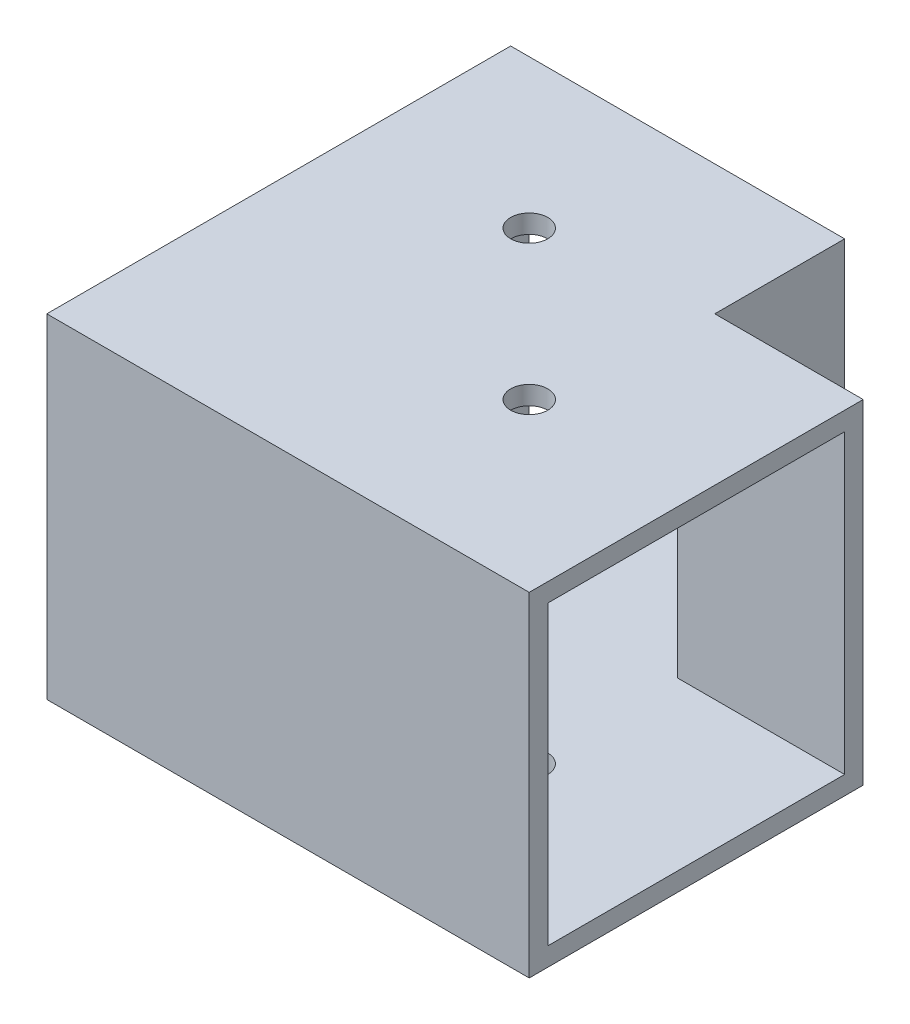
ISO-10303-21;
HEADER;
FILE_DESCRIPTION(('STEP AP214'),'2;1');
FILE_NAME('part.step','',(''),(''),'','','');
FILE_SCHEMA(('AUTOMOTIVE_DESIGN { 1 0 10303 214 1 1 1 1 }'));
ENDSEC;
DATA;
#1=APPLICATION_CONTEXT('core data for automotive mechanical design processes');
#2=APPLICATION_PROTOCOL_DEFINITION('international standard','automotive_design',2000,#1);
#3=PRODUCT_CONTEXT('',#1,'mechanical');
#4=PRODUCT('Part','Part','',(#3));
#5=PRODUCT_RELATED_PRODUCT_CATEGORY('part','',(#4));
#6=PRODUCT_DEFINITION_FORMATION('','',#4);
#7=PRODUCT_DEFINITION_CONTEXT('part definition',#1,'design');
#8=PRODUCT_DEFINITION('design','',#6,#7);
#9=PRODUCT_DEFINITION_SHAPE('','',#8);
#10=(LENGTH_UNIT() NAMED_UNIT(*) SI_UNIT(.MILLI.,.METRE.));
#11=(NAMED_UNIT(*) PLANE_ANGLE_UNIT() SI_UNIT($,.RADIAN.));
#12=(NAMED_UNIT(*) SI_UNIT($,.STERADIAN.) SOLID_ANGLE_UNIT());
#13=UNCERTAINTY_MEASURE_WITH_UNIT(LENGTH_MEASURE(1.E-05),#10,'distance_accuracy_value','');
#14=(GEOMETRIC_REPRESENTATION_CONTEXT(3) GLOBAL_UNCERTAINTY_ASSIGNED_CONTEXT((#13)) GLOBAL_UNIT_ASSIGNED_CONTEXT((#10,
#11,#12)) REPRESENTATION_CONTEXT('',''));
#15=CARTESIAN_POINT('',(0.,0.,0.));
#16=DIRECTION('',(0.,0.,1.));
#17=DIRECTION('',(1.,0.,0.));
#18=AXIS2_PLACEMENT_3D('',#15,#16,#17);
#19=CARTESIAN_POINT('',(0.,0.,50.8));
#20=DIRECTION('',(0.,0.,1.));
#21=DIRECTION('',(1.,0.,0.));
#22=AXIS2_PLACEMENT_3D('',#19,#20,#21);
#23=PLANE('',#22);
#24=DIRECTION('',(-1.,0.,0.));
#25=VECTOR('',#24,1.);
#26=CARTESIAN_POINT('',(107.95,50.8,50.8));
#27=LINE('',#26,#25);
#28=CARTESIAN_POINT('',(107.95,50.8,50.8));
#29=VERTEX_POINT('',#28);
#30=CARTESIAN_POINT('',(50.8,50.8,50.8));
#31=VERTEX_POINT('',#30);
#32=EDGE_CURVE('E200',#29,#31,#27,.T.);
#33=ORIENTED_EDGE('',*,*,#32,.T.);
#34=DIRECTION('',(0.,1.,0.));
#35=VECTOR('',#34,1.);
#36=CARTESIAN_POINT('',(50.8,-50.8,50.8));
#37=LINE('',#36,#35);
#38=CARTESIAN_POINT('',(50.8,-50.8,50.8));
#39=VERTEX_POINT('',#38);
#40=EDGE_CURVE('E254',#39,#31,#37,.T.);
#41=ORIENTED_EDGE('',*,*,#40,.F.);
#42=DIRECTION('',(-1.,0.,0.));
#43=VECTOR('',#42,1.);
#44=CARTESIAN_POINT('',(107.95,-50.8,50.8));
#45=LINE('',#44,#43);
#46=CARTESIAN_POINT('',(107.95,-50.8,50.8));
#47=VERTEX_POINT('',#46);
#48=EDGE_CURVE('E225',#47,#39,#45,.T.);
#49=ORIENTED_EDGE('',*,*,#48,.F.);
#50=DIRECTION('',(0.,1.,0.));
#51=VECTOR('',#50,1.);
#52=CARTESIAN_POINT('',(107.95,-50.8,50.8));
#53=LINE('',#52,#51);
#54=EDGE_CURVE('E217',#47,#29,#53,.T.);
#55=ORIENTED_EDGE('',*,*,#54,.T.);
#56=EDGE_LOOP('',(#33,#41,#49,#55));
#57=FACE_BOUND('',#56,.T.);
#58=ADVANCED_FACE('F88',(#57),#23,.T.);
#59=DIRECTION('',(0.,-1.,0.));
#60=VECTOR('',#59,1.);
#61=CARTESIAN_POINT('',(-50.8,-50.8,50.8));
#62=LINE('',#61,#60);
#63=CARTESIAN_POINT('',(-50.8,50.8,50.8));
#64=VERTEX_POINT('',#63);
#65=CARTESIAN_POINT('',(-50.8,-50.8,50.8));
#66=VERTEX_POINT('',#65);
#67=EDGE_CURVE('E257',#64,#66,#62,.T.);
#68=ORIENTED_EDGE('',*,*,#67,.F.);
#69=DIRECTION('',(1.,0.,0.));
#70=VECTOR('',#69,1.);
#71=CARTESIAN_POINT('',(-214.368613719877,50.8,50.8));
#72=LINE('',#71,#70);
#73=CARTESIAN_POINT('',(-57.15,50.8,50.8));
#74=VERTEX_POINT('',#73);
#75=EDGE_CURVE('E110',#74,#64,#72,.T.);
#76=ORIENTED_EDGE('',*,*,#75,.F.);
#77=DIRECTION('',(0.,-1.,0.));
#78=VECTOR('',#77,1.);
#79=CARTESIAN_POINT('',(-57.15,0.,50.8));
#80=LINE('',#79,#78);
#81=CARTESIAN_POINT('',(-57.15,-50.8,50.8));
#82=VERTEX_POINT('',#81);
#83=EDGE_CURVE('E105',#74,#82,#80,.T.);
#84=ORIENTED_EDGE('',*,*,#83,.T.);
#85=DIRECTION('',(1.,0.,0.));
#86=VECTOR('',#85,1.);
#87=CARTESIAN_POINT('',(-214.368613719877,-50.8,50.8));
#88=LINE('',#87,#86);
#89=EDGE_CURVE('E212',#82,#66,#88,.T.);
#90=ORIENTED_EDGE('',*,*,#89,.T.);
#91=EDGE_LOOP('',(#68,#76,#84,#90));
#92=FACE_BOUND('',#91,.T.);
#93=ADVANCED_FACE('F355',(#92),#23,.T.);
#94=CARTESIAN_POINT('',(57.15,0.,50.8));
#95=DIRECTION('',(-1.,0.,0.));
#96=DIRECTION('',(0.,0.,1.));
#97=AXIS2_PLACEMENT_3D('',#94,#95,#96);
#98=PLANE('',#97);
#99=DIRECTION('',(0.,1.,0.));
#100=VECTOR('',#99,1.);
#101=CARTESIAN_POINT('',(57.15,-50.8,44.45));
#102=LINE('',#101,#100);
#103=CARTESIAN_POINT('',(57.15,-57.15,44.45));
#104=VERTEX_POINT('',#103);
#105=CARTESIAN_POINT('',(57.15,57.15,44.45));
#106=VERTEX_POINT('',#105);
#107=EDGE_CURVE('E229',#104,#106,#102,.T.);
#108=ORIENTED_EDGE('',*,*,#107,.F.);
#109=DIRECTION('',(0.,0.,-1.));
#110=VECTOR('',#109,1.);
#111=CARTESIAN_POINT('',(57.15,-57.15,50.8));
#112=LINE('',#111,#110);
#113=CARTESIAN_POINT('',(57.15,-57.15,0.));
#114=VERTEX_POINT('',#113);
#115=EDGE_CURVE('E283',#104,#114,#112,.T.);
#116=ORIENTED_EDGE('',*,*,#115,.T.);
#117=DIRECTION('',(0.,1.,0.));
#118=VECTOR('',#117,1.);
#119=CARTESIAN_POINT('',(57.15,0.,0.));
#120=LINE('',#119,#118);
#121=CARTESIAN_POINT('',(57.15,57.15,0.));
#122=VERTEX_POINT('',#121);
#123=EDGE_CURVE('E281',#114,#122,#120,.T.);
#124=ORIENTED_EDGE('',*,*,#123,.T.);
#125=DIRECTION('',(0.,0.,-1.));
#126=VECTOR('',#125,1.);
#127=CARTESIAN_POINT('',(57.15,57.15,50.8));
#128=LINE('',#127,#126);
#129=EDGE_CURVE('E12',#106,#122,#128,.T.);
#130=ORIENTED_EDGE('',*,*,#129,.F.);
#131=EDGE_LOOP('',(#108,#116,#124,#130));
#132=FACE_BOUND('',#131,.T.);
#133=ADVANCED_FACE('F90',(#132),#98,.F.);
#134=CARTESIAN_POINT('',(0.,0.,0.));
#135=DIRECTION('',(0.,0.,1.));
#136=DIRECTION('',(1.,0.,0.));
#137=AXIS2_PLACEMENT_3D('',#134,#135,#136);
#138=PLANE('',#137);
#139=ORIENTED_EDGE('',*,*,#123,.F.);
#140=DIRECTION('',(1.,0.,0.));
#141=VECTOR('',#140,1.);
#142=CARTESIAN_POINT('',(0.,-57.15,0.));
#143=LINE('',#142,#141);
#144=CARTESIAN_POINT('',(-57.15,-57.15,0.));
#145=VERTEX_POINT('',#144);
#146=EDGE_CURVE('E284',#145,#114,#143,.T.);
#147=ORIENTED_EDGE('',*,*,#146,.F.);
#148=DIRECTION('',(0.,-1.,0.));
#149=VECTOR('',#148,1.);
#150=CARTESIAN_POINT('',(-57.15,0.,0.));
#151=LINE('',#150,#149);
#152=CARTESIAN_POINT('',(-57.15,57.15,0.));
#153=VERTEX_POINT('',#152);
#154=EDGE_CURVE('E289',#153,#145,#151,.T.);
#155=ORIENTED_EDGE('',*,*,#154,.F.);
#156=DIRECTION('',(-1.,0.,0.));
#157=VECTOR('',#156,1.);
#158=CARTESIAN_POINT('',(0.,57.15,0.));
#159=LINE('',#158,#157);
#160=EDGE_CURVE('E287',#122,#153,#159,.T.);
#161=ORIENTED_EDGE('',*,*,#160,.F.);
#162=EDGE_LOOP('',(#139,#147,#155,#161));
#163=FACE_BOUND('',#162,.T.);
#164=DIRECTION('',(0.,1.,0.));
#165=VECTOR('',#164,1.);
#166=CARTESIAN_POINT('',(50.8,-50.8,0.));
#167=LINE('',#166,#165);
#168=CARTESIAN_POINT('',(50.8,-50.8,0.));
#169=VERTEX_POINT('',#168);
#170=CARTESIAN_POINT('',(50.8,50.8,0.));
#171=VERTEX_POINT('',#170);
#172=EDGE_CURVE('E253',#169,#171,#167,.T.);
#173=ORIENTED_EDGE('',*,*,#172,.T.);
#174=DIRECTION('',(-1.,0.,0.));
#175=VECTOR('',#174,1.);
#176=CARTESIAN_POINT('',(-50.8,50.8,0.));
#177=LINE('',#176,#175);
#178=CARTESIAN_POINT('',(-50.8,50.8,0.));
#179=VERTEX_POINT('',#178);
#180=EDGE_CURVE('E264',#171,#179,#177,.T.);
#181=ORIENTED_EDGE('',*,*,#180,.T.);
#182=DIRECTION('',(0.,-1.,0.));
#183=VECTOR('',#182,1.);
#184=CARTESIAN_POINT('',(-50.8,-50.8,0.));
#185=LINE('',#184,#183);
#186=CARTESIAN_POINT('',(-50.8,-50.8,0.));
#187=VERTEX_POINT('',#186);
#188=EDGE_CURVE('E267',#179,#187,#185,.T.);
#189=ORIENTED_EDGE('',*,*,#188,.T.);
#190=DIRECTION('',(1.,0.,0.));
#191=VECTOR('',#190,1.);
#192=CARTESIAN_POINT('',(-50.8,-50.8,0.));
#193=LINE('',#192,#191);
#194=EDGE_CURVE('E258',#187,#169,#193,.T.);
#195=ORIENTED_EDGE('',*,*,#194,.T.);
#196=EDGE_LOOP('',(#173,#181,#189,#195));
#197=FACE_BOUND('',#196,.T.);
#198=ADVANCED_FACE('F326',(#163,#197),#138,.F.);
#199=CARTESIAN_POINT('',(0.,57.15,50.8));
#200=DIRECTION('',(0.,-1.,0.));
#201=DIRECTION('',(0.,0.,-1.));
#202=AXIS2_PLACEMENT_3D('',#199,#200,#201);
#203=PLANE('',#202);
#204=CARTESIAN_POINT('',(50.8,57.15,101.6));
#205=DIRECTION('',(0.,-1.,0.));
#206=DIRECTION('',(-1.,0.,0.));
#207=AXIS2_PLACEMENT_3D('',#204,#205,#206);
#208=CIRCLE('',#207,6.35);
#209=CARTESIAN_POINT('',(50.8,57.15,107.95));
#210=VERTEX_POINT('',#209);
#211=EDGE_CURVE('E379',#210,#210,#208,.T.);
#212=ORIENTED_EDGE('',*,*,#211,.T.);
#213=EDGE_LOOP('',(#212));
#214=FACE_BOUND('',#213,.T.);
#215=CARTESIAN_POINT('',(0.,57.15,50.8));
#216=DIRECTION('',(0.,1.,0.));
#217=DIRECTION('',(0.,0.,1.));
#218=AXIS2_PLACEMENT_3D('',#215,#216,#217);
#219=CIRCLE('',#218,6.35);
#220=CARTESIAN_POINT('',(0.,57.15,57.15));
#221=VERTEX_POINT('',#220);
#222=EDGE_CURVE('E307',#221,#221,#219,.T.);
#223=ORIENTED_EDGE('',*,*,#222,.F.);
#224=EDGE_LOOP('',(#223));
#225=FACE_BOUND('',#224,.T.);
#226=DIRECTION('',(0.,0.,-1.));
#227=VECTOR('',#226,1.);
#228=CARTESIAN_POINT('',(-57.15,57.15,50.8));
#229=LINE('',#228,#227);
#230=CARTESIAN_POINT('',(-57.15,57.15,158.75));
#231=VERTEX_POINT('',#230);
#232=EDGE_CURVE('E97',#231,#153,#229,.T.);
#233=ORIENTED_EDGE('',*,*,#232,.F.);
#234=DIRECTION('',(-1.,0.,0.));
#235=VECTOR('',#234,1.);
#236=CARTESIAN_POINT('',(107.95,57.15,158.75));
#237=LINE('',#236,#235);
#238=CARTESIAN_POINT('',(107.95,57.15,158.75));
#239=VERTEX_POINT('',#238);
#240=EDGE_CURVE('E247',#239,#231,#237,.T.);
#241=ORIENTED_EDGE('',*,*,#240,.F.);
#242=DIRECTION('',(0.,0.,1.));
#243=VECTOR('',#242,1.);
#244=CARTESIAN_POINT('',(107.95,57.15,50.8));
#245=LINE('',#244,#243);
#246=CARTESIAN_POINT('',(107.95,57.15,44.45));
#247=VERTEX_POINT('',#246);
#248=EDGE_CURVE('E233',#247,#239,#245,.T.);
#249=ORIENTED_EDGE('',*,*,#248,.F.);
#250=DIRECTION('',(-1.,0.,0.));
#251=VECTOR('',#250,1.);
#252=CARTESIAN_POINT('',(107.95,57.15,44.45));
#253=LINE('',#252,#251);
#254=EDGE_CURVE('E250',#247,#106,#253,.T.);
#255=ORIENTED_EDGE('',*,*,#254,.T.);
#256=ORIENTED_EDGE('',*,*,#129,.T.);
#257=ORIENTED_EDGE('',*,*,#160,.T.);
#258=EDGE_LOOP('',(#233,#241,#249,#255,#256,#257));
#259=FACE_BOUND('',#258,.T.);
#260=ADVANCED_FACE('F365',(#214,#225,#259),#203,.F.);
#261=CARTESIAN_POINT('',(-57.15,0.,50.8));
#262=DIRECTION('',(1.,0.,0.));
#263=DIRECTION('',(0.,0.,-1.));
#264=AXIS2_PLACEMENT_3D('',#261,#262,#263);
#265=PLANE('',#264);
#266=ORIENTED_EDGE('',*,*,#83,.F.);
#267=DIRECTION('',(0.,0.,-1.));
#268=VECTOR('',#267,1.);
#269=CARTESIAN_POINT('',(-57.15,50.8,50.8));
#270=LINE('',#269,#268);
#271=CARTESIAN_POINT('',(-57.15,50.8,152.4));
#272=VERTEX_POINT('',#271);
#273=EDGE_CURVE('E192',#272,#74,#270,.T.);
#274=ORIENTED_EDGE('',*,*,#273,.F.);
#275=DIRECTION('',(0.,1.,0.));
#276=VECTOR('',#275,1.);
#277=CARTESIAN_POINT('',(-57.15,50.8,152.4));
#278=LINE('',#277,#276);
#279=CARTESIAN_POINT('',(-57.15,-50.8,152.4));
#280=VERTEX_POINT('',#279);
#281=EDGE_CURVE('E207',#280,#272,#278,.T.);
#282=ORIENTED_EDGE('',*,*,#281,.F.);
#283=DIRECTION('',(0.,0.,1.));
#284=VECTOR('',#283,1.);
#285=CARTESIAN_POINT('',(-57.15,-50.8,152.4));
#286=LINE('',#285,#284);
#287=EDGE_CURVE('E219',#82,#280,#286,.T.);
#288=ORIENTED_EDGE('',*,*,#287,.F.);
#289=EDGE_LOOP('',(#266,#274,#282,#288));
#290=FACE_BOUND('',#289,.T.);
#291=ORIENTED_EDGE('',*,*,#154,.T.);
#292=DIRECTION('',(0.,0.,-1.));
#293=VECTOR('',#292,1.);
#294=CARTESIAN_POINT('',(-57.15,-57.15,50.8));
#295=LINE('',#294,#293);
#296=CARTESIAN_POINT('',(-57.15,-57.15,158.75));
#297=VERTEX_POINT('',#296);
#298=EDGE_CURVE('E294',#297,#145,#295,.T.);
#299=ORIENTED_EDGE('',*,*,#298,.F.);
#300=DIRECTION('',(0.,-1.,0.));
#301=VECTOR('',#300,1.);
#302=CARTESIAN_POINT('',(-57.15,-57.15,158.75));
#303=LINE('',#302,#301);
#304=EDGE_CURVE('E209',#231,#297,#303,.T.);
#305=ORIENTED_EDGE('',*,*,#304,.F.);
#306=ORIENTED_EDGE('',*,*,#232,.T.);
#307=EDGE_LOOP('',(#291,#299,#305,#306));
#308=FACE_BOUND('',#307,.T.);
#309=ADVANCED_FACE('F205',(#290,#308),#265,.F.);
#310=CARTESIAN_POINT('',(0.,-57.15,50.8));
#311=DIRECTION('',(0.,1.,0.));
#312=DIRECTION('',(0.,0.,1.));
#313=AXIS2_PLACEMENT_3D('',#310,#311,#312);
#314=PLANE('',#313);
#315=CARTESIAN_POINT('',(50.8,-57.15,101.6));
#316=DIRECTION('',(0.,-1.,0.));
#317=DIRECTION('',(-1.,0.,0.));
#318=AXIS2_PLACEMENT_3D('',#315,#316,#317);
#319=CIRCLE('',#318,6.35);
#320=CARTESIAN_POINT('',(50.8,-57.15,107.95));
#321=VERTEX_POINT('',#320);
#322=EDGE_CURVE('E607',#321,#321,#319,.T.);
#323=ORIENTED_EDGE('',*,*,#322,.F.);
#324=EDGE_LOOP('',(#323));
#325=FACE_BOUND('',#324,.T.);
#326=CARTESIAN_POINT('',(0.,-57.15,50.8));
#327=DIRECTION('',(0.,1.,0.));
#328=DIRECTION('',(0.,0.,1.));
#329=AXIS2_PLACEMENT_3D('',#326,#327,#328);
#330=CIRCLE('',#329,6.35);
#331=CARTESIAN_POINT('',(0.,-57.15,57.15));
#332=VERTEX_POINT('',#331);
#333=EDGE_CURVE('E301',#332,#332,#330,.T.);
#334=ORIENTED_EDGE('',*,*,#333,.T.);
#335=EDGE_LOOP('',(#334));
#336=FACE_BOUND('',#335,.T.);
#337=ORIENTED_EDGE('',*,*,#146,.T.);
#338=ORIENTED_EDGE('',*,*,#115,.F.);
#339=DIRECTION('',(-1.,0.,0.));
#340=VECTOR('',#339,1.);
#341=CARTESIAN_POINT('',(107.95,-57.15,44.45));
#342=LINE('',#341,#340);
#343=CARTESIAN_POINT('',(107.95,-57.15,44.45));
#344=VERTEX_POINT('',#343);
#345=EDGE_CURVE('E239',#344,#104,#342,.T.);
#346=ORIENTED_EDGE('',*,*,#345,.F.);
#347=DIRECTION('',(0.,0.,-1.));
#348=VECTOR('',#347,1.);
#349=CARTESIAN_POINT('',(107.95,-57.15,50.8));
#350=LINE('',#349,#348);
#351=CARTESIAN_POINT('',(107.95,-57.15,158.75));
#352=VERTEX_POINT('',#351);
#353=EDGE_CURVE('E237',#352,#344,#350,.T.);
#354=ORIENTED_EDGE('',*,*,#353,.F.);
#355=DIRECTION('',(-1.,0.,0.));
#356=VECTOR('',#355,1.);
#357=CARTESIAN_POINT('',(107.95,-57.15,158.75));
#358=LINE('',#357,#356);
#359=EDGE_CURVE('E244',#352,#297,#358,.T.);
#360=ORIENTED_EDGE('',*,*,#359,.T.);
#361=ORIENTED_EDGE('',*,*,#298,.T.);
#362=EDGE_LOOP('',(#337,#338,#346,#354,#360,#361));
#363=FACE_BOUND('',#362,.T.);
#364=ADVANCED_FACE('F367',(#325,#336,#363),#314,.F.);
#365=CARTESIAN_POINT('',(50.8,-50.8,50.8));
#366=DIRECTION('',(-1.,0.,0.));
#367=DIRECTION('',(0.,0.,1.));
#368=AXIS2_PLACEMENT_3D('',#365,#366,#367);
#369=PLANE('',#368);
#370=ORIENTED_EDGE('',*,*,#172,.F.);
#371=DIRECTION('',(0.,0.,-1.));
#372=VECTOR('',#371,1.);
#373=CARTESIAN_POINT('',(50.8,-50.8,50.8));
#374=LINE('',#373,#372);
#375=EDGE_CURVE('E261',#39,#169,#374,.T.);
#376=ORIENTED_EDGE('',*,*,#375,.F.);
#377=ORIENTED_EDGE('',*,*,#40,.T.);
#378=DIRECTION('',(0.,0.,-1.));
#379=VECTOR('',#378,1.);
#380=CARTESIAN_POINT('',(50.8,50.8,50.8));
#381=LINE('',#380,#379);
#382=EDGE_CURVE('E278',#31,#171,#381,.T.);
#383=ORIENTED_EDGE('',*,*,#382,.T.);
#384=EDGE_LOOP('',(#370,#376,#377,#383));
#385=FACE_BOUND('',#384,.T.);
#386=ADVANCED_FACE('F329',(#385),#369,.T.);
#387=CARTESIAN_POINT('',(-50.8,50.8,50.8));
#388=DIRECTION('',(0.,-1.,0.));
#389=DIRECTION('',(0.,0.,-1.));
#390=AXIS2_PLACEMENT_3D('',#387,#388,#389);
#391=PLANE('',#390);
#392=CARTESIAN_POINT('',(50.8,50.8,101.6));
#393=DIRECTION('',(0.,-1.,0.));
#394=DIRECTION('',(0.,0.,-1.));
#395=AXIS2_PLACEMENT_3D('',#392,#393,#394);
#396=CIRCLE('',#395,6.35);
#397=CARTESIAN_POINT('',(50.8,50.8,107.95));
#398=VERTEX_POINT('',#397);
#399=EDGE_CURVE('E312',#398,#398,#396,.F.);
#400=ORIENTED_EDGE('',*,*,#399,.T.);
#401=EDGE_LOOP('',(#400));
#402=FACE_BOUND('',#401,.T.);
#403=CARTESIAN_POINT('',(0.,50.8,50.8));
#404=DIRECTION('',(0.,-1.,0.));
#405=DIRECTION('',(0.,0.,-1.));
#406=AXIS2_PLACEMENT_3D('',#403,#404,#405);
#407=CIRCLE('',#406,6.35);
#408=CARTESIAN_POINT('',(0.,50.8,57.15));
#409=VERTEX_POINT('',#408);
#410=EDGE_CURVE('E300',#409,#409,#407,.T.);
#411=ORIENTED_EDGE('',*,*,#410,.F.);
#412=EDGE_LOOP('',(#411));
#413=FACE_BOUND('',#412,.T.);
#414=ORIENTED_EDGE('',*,*,#180,.F.);
#415=ORIENTED_EDGE('',*,*,#382,.F.);
#416=ORIENTED_EDGE('',*,*,#32,.F.);
#417=DIRECTION('',(0.,0.,1.));
#418=VECTOR('',#417,1.);
#419=CARTESIAN_POINT('',(107.95,50.8,50.8));
#420=LINE('',#419,#418);
#421=CARTESIAN_POINT('',(107.95,50.8,152.4));
#422=VERTEX_POINT('',#421);
#423=EDGE_CURVE('E195',#29,#422,#420,.T.);
#424=ORIENTED_EDGE('',*,*,#423,.T.);
#425=DIRECTION('',(-1.,0.,0.));
#426=VECTOR('',#425,1.);
#427=CARTESIAN_POINT('',(107.95,50.8,152.4));
#428=LINE('',#427,#426);
#429=EDGE_CURVE('E189',#422,#272,#428,.T.);
#430=ORIENTED_EDGE('',*,*,#429,.T.);
#431=ORIENTED_EDGE('',*,*,#273,.T.);
#432=ORIENTED_EDGE('',*,*,#75,.T.);
#433=DIRECTION('',(0.,0.,-1.));
#434=VECTOR('',#433,1.);
#435=CARTESIAN_POINT('',(-50.8,50.8,50.8));
#436=LINE('',#435,#434);
#437=EDGE_CURVE('E276',#64,#179,#436,.T.);
#438=ORIENTED_EDGE('',*,*,#437,.T.);
#439=EDGE_LOOP('',(#414,#415,#416,#424,#430,#431,#432,#438));
#440=FACE_BOUND('',#439,.T.);
#441=ADVANCED_FACE('F191',(#402,#413,#440),#391,.T.);
#442=CARTESIAN_POINT('',(-50.8,-50.8,50.8));
#443=DIRECTION('',(1.,0.,0.));
#444=DIRECTION('',(0.,0.,-1.));
#445=AXIS2_PLACEMENT_3D('',#442,#443,#444);
#446=PLANE('',#445);
#447=ORIENTED_EDGE('',*,*,#188,.F.);
#448=ORIENTED_EDGE('',*,*,#437,.F.);
#449=ORIENTED_EDGE('',*,*,#67,.T.);
#450=DIRECTION('',(0.,0.,-1.));
#451=VECTOR('',#450,1.);
#452=CARTESIAN_POINT('',(-50.8,-50.8,50.8));
#453=LINE('',#452,#451);
#454=EDGE_CURVE('E274',#66,#187,#453,.T.);
#455=ORIENTED_EDGE('',*,*,#454,.T.);
#456=EDGE_LOOP('',(#447,#448,#449,#455));
#457=FACE_BOUND('',#456,.T.);
#458=ADVANCED_FACE('F322',(#457),#446,.T.);
#459=CARTESIAN_POINT('',(-50.8,-50.8,50.8));
#460=DIRECTION('',(0.,1.,0.));
#461=DIRECTION('',(0.,0.,1.));
#462=AXIS2_PLACEMENT_3D('',#459,#460,#461);
#463=PLANE('',#462);
#464=CARTESIAN_POINT('',(50.8,-50.8,101.6));
#465=DIRECTION('',(0.,1.,0.));
#466=DIRECTION('',(0.,0.,1.));
#467=AXIS2_PLACEMENT_3D('',#464,#465,#466);
#468=CIRCLE('',#467,6.35);
#469=CARTESIAN_POINT('',(50.8,-50.8,107.95));
#470=VERTEX_POINT('',#469);
#471=EDGE_CURVE('E92',#470,#470,#468,.F.);
#472=ORIENTED_EDGE('',*,*,#471,.T.);
#473=EDGE_LOOP('',(#472));
#474=FACE_BOUND('',#473,.T.);
#475=CARTESIAN_POINT('',(0.,-50.8,50.8));
#476=DIRECTION('',(0.,1.,0.));
#477=DIRECTION('',(0.,0.,1.));
#478=AXIS2_PLACEMENT_3D('',#475,#476,#477);
#479=CIRCLE('',#478,6.35);
#480=CARTESIAN_POINT('',(0.,-50.8,57.15));
#481=VERTEX_POINT('',#480);
#482=EDGE_CURVE('E298',#481,#481,#479,.T.);
#483=ORIENTED_EDGE('',*,*,#482,.F.);
#484=EDGE_LOOP('',(#483));
#485=FACE_BOUND('',#484,.T.);
#486=ORIENTED_EDGE('',*,*,#194,.F.);
#487=ORIENTED_EDGE('',*,*,#454,.F.);
#488=ORIENTED_EDGE('',*,*,#89,.F.);
#489=ORIENTED_EDGE('',*,*,#287,.T.);
#490=DIRECTION('',(-1.,0.,0.));
#491=VECTOR('',#490,1.);
#492=CARTESIAN_POINT('',(107.95,-50.8,152.4));
#493=LINE('',#492,#491);
#494=CARTESIAN_POINT('',(107.95,-50.8,152.4));
#495=VERTEX_POINT('',#494);
#496=EDGE_CURVE('E201',#495,#280,#493,.T.);
#497=ORIENTED_EDGE('',*,*,#496,.F.);
#498=DIRECTION('',(0.,0.,-1.));
#499=VECTOR('',#498,1.);
#500=CARTESIAN_POINT('',(107.95,-50.8,50.8));
#501=LINE('',#500,#499);
#502=EDGE_CURVE('E223',#495,#47,#501,.T.);
#503=ORIENTED_EDGE('',*,*,#502,.T.);
#504=ORIENTED_EDGE('',*,*,#48,.T.);
#505=ORIENTED_EDGE('',*,*,#375,.T.);
#506=EDGE_LOOP('',(#486,#487,#488,#489,#497,#503,#504,#505));
#507=FACE_BOUND('',#506,.T.);
#508=ADVANCED_FACE('F332',(#474,#485,#507),#463,.T.);
#509=CARTESIAN_POINT('',(107.95,0.,0.));
#510=DIRECTION('',(1.,0.,0.));
#511=DIRECTION('',(0.,0.,-1.));
#512=AXIS2_PLACEMENT_3D('',#509,#510,#511);
#513=PLANE('',#512);
#514=DIRECTION('',(0.,1.,0.));
#515=VECTOR('',#514,1.);
#516=CARTESIAN_POINT('',(107.95,-50.8,44.45));
#517=LINE('',#516,#515);
#518=EDGE_CURVE('E230',#344,#247,#517,.T.);
#519=ORIENTED_EDGE('',*,*,#518,.T.);
#520=ORIENTED_EDGE('',*,*,#248,.T.);
#521=DIRECTION('',(0.,-1.,0.));
#522=VECTOR('',#521,1.);
#523=CARTESIAN_POINT('',(107.95,-50.8,158.75));
#524=LINE('',#523,#522);
#525=EDGE_CURVE('E235',#239,#352,#524,.T.);
#526=ORIENTED_EDGE('',*,*,#525,.T.);
#527=ORIENTED_EDGE('',*,*,#353,.T.);
#528=EDGE_LOOP('',(#519,#520,#526,#527));
#529=FACE_BOUND('',#528,.T.);
#530=ORIENTED_EDGE('',*,*,#423,.F.);
#531=ORIENTED_EDGE('',*,*,#54,.F.);
#532=ORIENTED_EDGE('',*,*,#502,.F.);
#533=DIRECTION('',(0.,-1.,0.));
#534=VECTOR('',#533,1.);
#535=CARTESIAN_POINT('',(107.95,-50.8,152.4));
#536=LINE('',#535,#534);
#537=EDGE_CURVE('E221',#422,#495,#536,.T.);
#538=ORIENTED_EDGE('',*,*,#537,.F.);
#539=EDGE_LOOP('',(#530,#531,#532,#538));
#540=FACE_BOUND('',#539,.T.);
#541=ADVANCED_FACE('F338',(#529,#540),#513,.T.);
#542=CARTESIAN_POINT('',(107.95,-50.8,44.45));
#543=DIRECTION('',(0.,0.,1.));
#544=DIRECTION('',(1.,0.,0.));
#545=AXIS2_PLACEMENT_3D('',#542,#543,#544);
#546=PLANE('',#545);
#547=ORIENTED_EDGE('',*,*,#107,.T.);
#548=ORIENTED_EDGE('',*,*,#254,.F.);
#549=ORIENTED_EDGE('',*,*,#518,.F.);
#550=ORIENTED_EDGE('',*,*,#345,.T.);
#551=EDGE_LOOP('',(#547,#548,#549,#550));
#552=FACE_BOUND('',#551,.T.);
#553=ADVANCED_FACE('F340',(#552),#546,.F.);
#554=CARTESIAN_POINT('',(107.95,-50.8,158.75));
#555=DIRECTION('',(0.,0.,-1.));
#556=DIRECTION('',(-1.,0.,0.));
#557=AXIS2_PLACEMENT_3D('',#554,#555,#556);
#558=PLANE('',#557);
#559=ORIENTED_EDGE('',*,*,#240,.T.);
#560=ORIENTED_EDGE('',*,*,#304,.T.);
#561=ORIENTED_EDGE('',*,*,#359,.F.);
#562=ORIENTED_EDGE('',*,*,#525,.F.);
#563=EDGE_LOOP('',(#559,#560,#561,#562));
#564=FACE_BOUND('',#563,.T.);
#565=ADVANCED_FACE('F347',(#564),#558,.F.);
#566=CARTESIAN_POINT('',(107.95,-50.8,152.4));
#567=DIRECTION('',(0.,0.,-1.));
#568=DIRECTION('',(-1.,0.,0.));
#569=AXIS2_PLACEMENT_3D('',#566,#567,#568);
#570=PLANE('',#569);
#571=ORIENTED_EDGE('',*,*,#496,.T.);
#572=ORIENTED_EDGE('',*,*,#281,.T.);
#573=ORIENTED_EDGE('',*,*,#429,.F.);
#574=ORIENTED_EDGE('',*,*,#537,.T.);
#575=EDGE_LOOP('',(#571,#572,#573,#574));
#576=FACE_BOUND('',#575,.T.);
#577=ADVANCED_FACE('F211',(#576),#570,.T.);
#578=CARTESIAN_POINT('',(0.,-57.15,50.8));
#579=DIRECTION('',(0.,1.,0.));
#580=DIRECTION('',(0.,0.,1.));
#581=AXIS2_PLACEMENT_3D('',#578,#579,#580);
#582=CYLINDRICAL_SURFACE('',#581,6.35);
#583=CARTESIAN_POINT('',(0.,-50.8,57.15));
#584=CARTESIAN_POINT('',(0.,-50.8661458333333,57.15));
#585=CARTESIAN_POINT('',(0.,-50.9322916666667,57.15));
#586=CARTESIAN_POINT('',(0.,-51.0645833333333,57.15));
#587=CARTESIAN_POINT('',(0.,-51.1307291666667,57.15));
#588=CARTESIAN_POINT('',(0.,-51.2630208333333,57.15));
#589=CARTESIAN_POINT('',(0.,-51.3291666666667,57.15));
#590=CARTESIAN_POINT('',(0.,-51.4614583333333,57.15));
#591=CARTESIAN_POINT('',(0.,-51.5276041666667,57.15));
#592=CARTESIAN_POINT('',(0.,-51.6598958333333,57.15));
#593=CARTESIAN_POINT('',(0.,-51.7260416666667,57.15));
#594=CARTESIAN_POINT('',(0.,-51.8583333333333,57.15));
#595=CARTESIAN_POINT('',(0.,-51.9244791666667,57.15));
#596=CARTESIAN_POINT('',(0.,-52.0567708333333,57.15));
#597=CARTESIAN_POINT('',(0.,-52.1229166666667,57.15));
#598=CARTESIAN_POINT('',(0.,-52.2552083333333,57.15));
#599=CARTESIAN_POINT('',(0.,-52.3213541666667,57.15));
#600=CARTESIAN_POINT('',(0.,-52.4536458333333,57.15));
#601=CARTESIAN_POINT('',(0.,-52.5197916666667,57.15));
#602=CARTESIAN_POINT('',(0.,-52.6520833333333,57.15));
#603=CARTESIAN_POINT('',(0.,-52.7182291666667,57.15));
#604=CARTESIAN_POINT('',(0.,-52.8505208333333,57.15));
#605=CARTESIAN_POINT('',(0.,-52.9166666666667,57.15));
#606=CARTESIAN_POINT('',(0.,-53.0489583333333,57.15));
#607=CARTESIAN_POINT('',(0.,-53.1151041666667,57.15));
#608=CARTESIAN_POINT('',(0.,-53.2473958333333,57.15));
#609=CARTESIAN_POINT('',(0.,-53.3135416666667,57.15));
#610=CARTESIAN_POINT('',(0.,-53.4458333333333,57.15));
#611=CARTESIAN_POINT('',(0.,-53.5119791666667,57.15));
#612=CARTESIAN_POINT('',(0.,-53.6442708333333,57.15));
#613=CARTESIAN_POINT('',(0.,-53.7104166666667,57.15));
#614=CARTESIAN_POINT('',(0.,-53.8427083333333,57.15));
#615=CARTESIAN_POINT('',(0.,-53.9088541666667,57.15));
#616=CARTESIAN_POINT('',(0.,-54.0411458333333,57.15));
#617=CARTESIAN_POINT('',(0.,-54.1072916666667,57.15));
#618=CARTESIAN_POINT('',(0.,-54.2395833333333,57.15));
#619=CARTESIAN_POINT('',(0.,-54.3057291666667,57.15));
#620=CARTESIAN_POINT('',(0.,-54.4380208333333,57.15));
#621=CARTESIAN_POINT('',(0.,-54.5041666666667,57.15));
#622=CARTESIAN_POINT('',(0.,-54.6364583333333,57.15));
#623=CARTESIAN_POINT('',(0.,-54.7026041666667,57.15));
#624=CARTESIAN_POINT('',(0.,-54.8348958333333,57.15));
#625=CARTESIAN_POINT('',(0.,-54.9010416666667,57.15));
#626=CARTESIAN_POINT('',(0.,-55.0333333333333,57.15));
#627=CARTESIAN_POINT('',(0.,-55.0994791666667,57.15));
#628=CARTESIAN_POINT('',(0.,-55.2317708333333,57.15));
#629=CARTESIAN_POINT('',(0.,-55.2979166666667,57.15));
#630=CARTESIAN_POINT('',(0.,-55.4302083333333,57.15));
#631=CARTESIAN_POINT('',(0.,-55.4963541666667,57.15));
#632=CARTESIAN_POINT('',(0.,-55.6286458333334,57.15));
#633=CARTESIAN_POINT('',(0.,-55.6947916666667,57.15));
#634=CARTESIAN_POINT('',(0.,-55.8270833333333,57.15));
#635=CARTESIAN_POINT('',(0.,-55.8932291666667,57.15));
#636=CARTESIAN_POINT('',(0.,-56.0255208333333,57.15));
#637=CARTESIAN_POINT('',(0.,-56.0916666666667,57.15));
#638=CARTESIAN_POINT('',(0.,-56.2239583333333,57.15));
#639=CARTESIAN_POINT('',(0.,-56.2901041666667,57.15));
#640=CARTESIAN_POINT('',(0.,-56.4223958333333,57.15));
#641=CARTESIAN_POINT('',(0.,-56.4885416666667,57.15));
#642=CARTESIAN_POINT('',(0.,-56.6208333333334,57.15));
#643=CARTESIAN_POINT('',(0.,-56.6869791666667,57.15));
#644=CARTESIAN_POINT('',(0.,-56.8192708333333,57.15));
#645=CARTESIAN_POINT('',(0.,-56.8854166666667,57.15));
#646=CARTESIAN_POINT('',(0.,-57.0177083333333,57.15));
#647=CARTESIAN_POINT('',(0.,-57.0838541666667,57.15));
#648=CARTESIAN_POINT('',(0.,-57.15,57.15));
#649=B_SPLINE_CURVE_WITH_KNOTS('',3,(#583,#584,#585,#586,#587,#588,#589,#590,#591,#592,#593,
#594,#595,#596,#597,#598,#599,#600,#601,#602,#603,#604,#605,#606,#607,#608,#609,#610,#611,#612,
#613,#614,#615,#616,#617,#618,#619,#620,#621,#622,#623,#624,#625,#626,#627,#628,#629,#630,#631,
#632,#633,#634,#635,#636,#637,#638,#639,#640,#641,#642,#643,#644,#645,#646,#647,#648),
.UNSPECIFIED.,.F.,.F.,(4,2,2,2,2,2,2,2,2,2,2,2,2,2,2,2,2,2,2,2,2,2,2,2,2,2,2,2,2,2,2,2,4),(0.,
0.198437499999995,0.396874999999998,0.5953125,0.793750000000003,0.992187499999998,1.190625,
1.3890625,1.5875,1.7859375,1.984375,2.1828125,2.38125,2.5796875,2.77812500000001,2.9765625,
3.175,3.37343750000001,3.57187500000001,3.7703125,3.96875000000001,4.16718750000001,4.365625,
4.56406250000001,4.76250000000001,4.96093750000001,5.15937500000001,5.35781250000001,
5.55625000000001,5.75468750000001,5.95312500000001,6.15156250000001,6.35000000000001),.UNSPECIFIED.);
#650=EDGE_CURVE('BSEAM506',#481,#332,#649,.T.);
#651=ORIENTED_EDGE('',*,*,#482,.T.);
#652=ORIENTED_EDGE('',*,*,#333,.F.);
#653=ORIENTED_EDGE('',*,*,#650,.T.);
#654=ORIENTED_EDGE('',*,*,#650,.F.);
#655=EDGE_LOOP('',(#651,#653,#652,#654));
#656=FACE_BOUND('',#655,.T.);
#657=ADVANCED_FACE('F506',(#656),#582,.F.);
#658=CARTESIAN_POINT('',(0.,50.8,57.15));
#659=CARTESIAN_POINT('',(0.,50.8661458333333,57.15));
#660=CARTESIAN_POINT('',(0.,50.9322916666667,57.15));
#661=CARTESIAN_POINT('',(0.,51.0645833333333,57.15));
#662=CARTESIAN_POINT('',(0.,51.1307291666667,57.15));
#663=CARTESIAN_POINT('',(0.,51.2630208333333,57.15));
#664=CARTESIAN_POINT('',(0.,51.3291666666667,57.15));
#665=CARTESIAN_POINT('',(0.,51.4614583333333,57.15));
#666=CARTESIAN_POINT('',(0.,51.5276041666667,57.15));
#667=CARTESIAN_POINT('',(0.,51.6598958333333,57.15));
#668=CARTESIAN_POINT('',(0.,51.7260416666667,57.15));
#669=CARTESIAN_POINT('',(0.,51.8583333333333,57.15));
#670=CARTESIAN_POINT('',(0.,51.9244791666667,57.15));
#671=CARTESIAN_POINT('',(0.,52.0567708333333,57.15));
#672=CARTESIAN_POINT('',(0.,52.1229166666667,57.15));
#673=CARTESIAN_POINT('',(0.,52.2552083333333,57.15));
#674=CARTESIAN_POINT('',(0.,52.3213541666667,57.15));
#675=CARTESIAN_POINT('',(0.,52.4536458333333,57.15));
#676=CARTESIAN_POINT('',(0.,52.5197916666667,57.15));
#677=CARTESIAN_POINT('',(0.,52.6520833333333,57.15));
#678=CARTESIAN_POINT('',(0.,52.7182291666667,57.15));
#679=CARTESIAN_POINT('',(0.,52.8505208333333,57.15));
#680=CARTESIAN_POINT('',(0.,52.9166666666667,57.15));
#681=CARTESIAN_POINT('',(0.,53.0489583333333,57.15));
#682=CARTESIAN_POINT('',(0.,53.1151041666667,57.15));
#683=CARTESIAN_POINT('',(0.,53.2473958333333,57.15));
#684=CARTESIAN_POINT('',(0.,53.3135416666667,57.15));
#685=CARTESIAN_POINT('',(0.,53.4458333333333,57.15));
#686=CARTESIAN_POINT('',(0.,53.5119791666667,57.15));
#687=CARTESIAN_POINT('',(0.,53.6442708333333,57.15));
#688=CARTESIAN_POINT('',(0.,53.7104166666667,57.15));
#689=CARTESIAN_POINT('',(0.,53.8427083333333,57.15));
#690=CARTESIAN_POINT('',(0.,53.9088541666667,57.15));
#691=CARTESIAN_POINT('',(0.,54.0411458333333,57.15));
#692=CARTESIAN_POINT('',(0.,54.1072916666667,57.15));
#693=CARTESIAN_POINT('',(0.,54.2395833333333,57.15));
#694=CARTESIAN_POINT('',(0.,54.3057291666667,57.15));
#695=CARTESIAN_POINT('',(0.,54.4380208333333,57.15));
#696=CARTESIAN_POINT('',(0.,54.5041666666667,57.15));
#697=CARTESIAN_POINT('',(0.,54.6364583333333,57.15));
#698=CARTESIAN_POINT('',(0.,54.7026041666667,57.15));
#699=CARTESIAN_POINT('',(0.,54.8348958333333,57.15));
#700=CARTESIAN_POINT('',(0.,54.9010416666667,57.15));
#701=CARTESIAN_POINT('',(0.,55.0333333333333,57.15));
#702=CARTESIAN_POINT('',(0.,55.0994791666667,57.15));
#703=CARTESIAN_POINT('',(0.,55.2317708333333,57.15));
#704=CARTESIAN_POINT('',(0.,55.2979166666667,57.15));
#705=CARTESIAN_POINT('',(0.,55.4302083333333,57.15));
#706=CARTESIAN_POINT('',(0.,55.4963541666667,57.15));
#707=CARTESIAN_POINT('',(0.,55.6286458333333,57.15));
#708=CARTESIAN_POINT('',(0.,55.6947916666667,57.15));
#709=CARTESIAN_POINT('',(0.,55.8270833333333,57.15));
#710=CARTESIAN_POINT('',(0.,55.8932291666667,57.15));
#711=CARTESIAN_POINT('',(0.,56.0255208333333,57.15));
#712=CARTESIAN_POINT('',(0.,56.0916666666667,57.15));
#713=CARTESIAN_POINT('',(0.,56.2239583333333,57.15));
#714=CARTESIAN_POINT('',(0.,56.2901041666667,57.15));
#715=CARTESIAN_POINT('',(0.,56.4223958333333,57.15));
#716=CARTESIAN_POINT('',(0.,56.4885416666667,57.15));
#717=CARTESIAN_POINT('',(0.,56.6208333333333,57.15));
#718=CARTESIAN_POINT('',(0.,56.6869791666667,57.15));
#719=CARTESIAN_POINT('',(0.,56.8192708333333,57.15));
#720=CARTESIAN_POINT('',(0.,56.8854166666667,57.15));
#721=CARTESIAN_POINT('',(0.,57.0177083333333,57.15));
#722=CARTESIAN_POINT('',(0.,57.0838541666667,57.15));
#723=CARTESIAN_POINT('',(0.,57.15,57.15));
#724=B_SPLINE_CURVE_WITH_KNOTS('',3,(#658,#659,#660,#661,#662,#663,#664,#665,#666,#667,#668,
#669,#670,#671,#672,#673,#674,#675,#676,#677,#678,#679,#680,#681,#682,#683,#684,#685,#686,#687,
#688,#689,#690,#691,#692,#693,#694,#695,#696,#697,#698,#699,#700,#701,#702,#703,#704,#705,#706,
#707,#708,#709,#710,#711,#712,#713,#714,#715,#716,#717,#718,#719,#720,#721,#722,#723),
.UNSPECIFIED.,.F.,.F.,(4,2,2,2,2,2,2,2,2,2,2,2,2,2,2,2,2,2,2,2,2,2,2,2,2,2,2,2,2,2,2,2,4),(0.,
0.198437499999995,0.396874999999991,0.5953125,0.793749999999996,0.992187499999991,1.190625,
1.3890625,1.58749999999999,1.78593749999999,1.98437499999998,2.18281249999999,2.38124999999999,
2.57968749999998,2.77812499999999,2.97656249999999,3.17499999999998,3.37343749999998,
3.57187499999997,3.77031249999998,3.96874999999998,4.16718749999997,4.36562499999998,
4.56406249999998,4.76249999999998,4.96093749999997,5.15937499999997,5.35781249999998,
5.55624999999997,5.75468749999997,5.95312499999998,6.15156249999997,6.34999999999997),.UNSPECIFIED.);
#725=EDGE_CURVE('BSEAM525',#409,#221,#724,.T.);
#726=ORIENTED_EDGE('',*,*,#410,.T.);
#727=ORIENTED_EDGE('',*,*,#222,.T.);
#728=ORIENTED_EDGE('',*,*,#725,.T.);
#729=ORIENTED_EDGE('',*,*,#725,.F.);
#730=EDGE_LOOP('',(#726,#728,#727,#729));
#731=FACE_BOUND('',#730,.T.);
#732=ADVANCED_FACE('F525',(#731),#582,.F.);
#733=CARTESIAN_POINT('',(50.8,-57.15,101.6));
#734=DIRECTION('',(0.,1.,0.));
#735=DIRECTION('',(0.,0.,1.));
#736=AXIS2_PLACEMENT_3D('',#733,#734,#735);
#737=CYLINDRICAL_SURFACE('',#736,6.35);
#738=CARTESIAN_POINT('',(50.8,-50.8,107.95));
#739=CARTESIAN_POINT('',(50.8,-50.8661458333333,107.95));
#740=CARTESIAN_POINT('',(50.8,-50.9322916666667,107.95));
#741=CARTESIAN_POINT('',(50.8,-51.0645833333333,107.95));
#742=CARTESIAN_POINT('',(50.8,-51.1307291666667,107.95));
#743=CARTESIAN_POINT('',(50.8,-51.2630208333333,107.95));
#744=CARTESIAN_POINT('',(50.8,-51.3291666666667,107.95));
#745=CARTESIAN_POINT('',(50.8,-51.4614583333333,107.95));
#746=CARTESIAN_POINT('',(50.8,-51.5276041666667,107.95));
#747=CARTESIAN_POINT('',(50.8,-51.6598958333333,107.95));
#748=CARTESIAN_POINT('',(50.8,-51.7260416666667,107.95));
#749=CARTESIAN_POINT('',(50.8,-51.8583333333333,107.95));
#750=CARTESIAN_POINT('',(50.8,-51.9244791666667,107.95));
#751=CARTESIAN_POINT('',(50.8,-52.0567708333333,107.95));
#752=CARTESIAN_POINT('',(50.8,-52.1229166666667,107.95));
#753=CARTESIAN_POINT('',(50.8,-52.2552083333333,107.95));
#754=CARTESIAN_POINT('',(50.8,-52.3213541666667,107.95));
#755=CARTESIAN_POINT('',(50.8,-52.4536458333333,107.95));
#756=CARTESIAN_POINT('',(50.8,-52.5197916666667,107.95));
#757=CARTESIAN_POINT('',(50.8,-52.6520833333333,107.95));
#758=CARTESIAN_POINT('',(50.8,-52.7182291666667,107.95));
#759=CARTESIAN_POINT('',(50.8,-52.8505208333333,107.95));
#760=CARTESIAN_POINT('',(50.8,-52.9166666666667,107.95));
#761=CARTESIAN_POINT('',(50.8,-53.0489583333333,107.95));
#762=CARTESIAN_POINT('',(50.8,-53.1151041666667,107.95));
#763=CARTESIAN_POINT('',(50.8,-53.2473958333333,107.95));
#764=CARTESIAN_POINT('',(50.8,-53.3135416666667,107.95));
#765=CARTESIAN_POINT('',(50.8,-53.4458333333333,107.95));
#766=CARTESIAN_POINT('',(50.8,-53.5119791666667,107.95));
#767=CARTESIAN_POINT('',(50.8,-53.6442708333333,107.95));
#768=CARTESIAN_POINT('',(50.8,-53.7104166666667,107.95));
#769=CARTESIAN_POINT('',(50.8,-53.8427083333333,107.95));
#770=CARTESIAN_POINT('',(50.8,-53.9088541666667,107.95));
#771=CARTESIAN_POINT('',(50.8,-54.0411458333333,107.95));
#772=CARTESIAN_POINT('',(50.8,-54.1072916666667,107.95));
#773=CARTESIAN_POINT('',(50.8,-54.2395833333333,107.95));
#774=CARTESIAN_POINT('',(50.8,-54.3057291666667,107.95));
#775=CARTESIAN_POINT('',(50.8,-54.4380208333333,107.95));
#776=CARTESIAN_POINT('',(50.8,-54.5041666666667,107.95));
#777=CARTESIAN_POINT('',(50.8,-54.6364583333333,107.95));
#778=CARTESIAN_POINT('',(50.8,-54.7026041666667,107.95));
#779=CARTESIAN_POINT('',(50.8,-54.8348958333333,107.95));
#780=CARTESIAN_POINT('',(50.8,-54.9010416666667,107.95));
#781=CARTESIAN_POINT('',(50.8,-55.0333333333333,107.95));
#782=CARTESIAN_POINT('',(50.8,-55.0994791666667,107.95));
#783=CARTESIAN_POINT('',(50.8,-55.2317708333333,107.95));
#784=CARTESIAN_POINT('',(50.8,-55.2979166666667,107.95));
#785=CARTESIAN_POINT('',(50.8,-55.4302083333333,107.95));
#786=CARTESIAN_POINT('',(50.8,-55.4963541666667,107.95));
#787=CARTESIAN_POINT('',(50.8,-55.6286458333333,107.95));
#788=CARTESIAN_POINT('',(50.8,-55.6947916666667,107.95));
#789=CARTESIAN_POINT('',(50.8,-55.8270833333333,107.95));
#790=CARTESIAN_POINT('',(50.8,-55.8932291666667,107.95));
#791=CARTESIAN_POINT('',(50.8,-56.0255208333333,107.95));
#792=CARTESIAN_POINT('',(50.8,-56.0916666666667,107.95));
#793=CARTESIAN_POINT('',(50.8,-56.2239583333333,107.95));
#794=CARTESIAN_POINT('',(50.8,-56.2901041666667,107.95));
#795=CARTESIAN_POINT('',(50.8,-56.4223958333333,107.95));
#796=CARTESIAN_POINT('',(50.8,-56.4885416666667,107.95));
#797=CARTESIAN_POINT('',(50.8,-56.6208333333333,107.95));
#798=CARTESIAN_POINT('',(50.8,-56.6869791666667,107.95));
#799=CARTESIAN_POINT('',(50.8,-56.8192708333333,107.95));
#800=CARTESIAN_POINT('',(50.8,-56.8854166666667,107.95));
#801=CARTESIAN_POINT('',(50.8,-57.0177083333333,107.95));
#802=CARTESIAN_POINT('',(50.8,-57.0838541666667,107.95));
#803=CARTESIAN_POINT('',(50.8,-57.15,107.95));
#804=B_SPLINE_CURVE_WITH_KNOTS('',3,(#738,#739,#740,#741,#742,#743,#744,#745,#746,#747,#748,
#749,#750,#751,#752,#753,#754,#755,#756,#757,#758,#759,#760,#761,#762,#763,#764,#765,#766,#767,
#768,#769,#770,#771,#772,#773,#774,#775,#776,#777,#778,#779,#780,#781,#782,#783,#784,#785,#786,
#787,#788,#789,#790,#791,#792,#793,#794,#795,#796,#797,#798,#799,#800,#801,#802,#803),
.UNSPECIFIED.,.F.,.F.,(4,2,2,2,2,2,2,2,2,2,2,2,2,2,2,2,2,2,2,2,2,2,2,2,2,2,2,2,2,2,2,2,4),(0.,
0.198437499999995,0.396874999999998,0.5953125,0.793749999999996,0.992187499999998,1.190625,
1.3890625,1.5875,1.7859375,1.984375,2.1828125,2.38125,2.5796875,2.778125,2.9765625,3.175,
3.3734375,3.571875,3.7703125,3.96875,4.1671875,4.365625,4.5640625,4.7625,4.96093750000001,
5.159375,5.3578125,5.55625000000001,5.75468750000001,5.953125,6.15156250000001,
6.35000000000001),.UNSPECIFIED.);
#805=EDGE_CURVE('BSEAM534',#470,#321,#804,.T.);
#806=ORIENTED_EDGE('',*,*,#471,.F.);
#807=ORIENTED_EDGE('',*,*,#322,.T.);
#808=ORIENTED_EDGE('',*,*,#805,.T.);
#809=ORIENTED_EDGE('',*,*,#805,.F.);
#810=EDGE_LOOP('',(#806,#808,#807,#809));
#811=FACE_BOUND('',#810,.T.);
#812=ADVANCED_FACE('F534',(#811),#737,.F.);
#813=CARTESIAN_POINT('',(50.8,50.8,107.95));
#814=CARTESIAN_POINT('',(50.8,50.8661458333333,107.95));
#815=CARTESIAN_POINT('',(50.8,50.9322916666667,107.95));
#816=CARTESIAN_POINT('',(50.8,51.0645833333334,107.95));
#817=CARTESIAN_POINT('',(50.8,51.1307291666667,107.95));
#818=CARTESIAN_POINT('',(50.8,51.2630208333333,107.95));
#819=CARTESIAN_POINT('',(50.8,51.3291666666667,107.95));
#820=CARTESIAN_POINT('',(50.8,51.4614583333333,107.95));
#821=CARTESIAN_POINT('',(50.8,51.5276041666667,107.95));
#822=CARTESIAN_POINT('',(50.8,51.6598958333334,107.95));
#823=CARTESIAN_POINT('',(50.8,51.7260416666667,107.95));
#824=CARTESIAN_POINT('',(50.8,51.8583333333334,107.95));
#825=CARTESIAN_POINT('',(50.8,51.9244791666667,107.95));
#826=CARTESIAN_POINT('',(50.8,52.0567708333333,107.95));
#827=CARTESIAN_POINT('',(50.8,52.1229166666667,107.95));
#828=CARTESIAN_POINT('',(50.8,52.2552083333333,107.95));
#829=CARTESIAN_POINT('',(50.8,52.3213541666667,107.95));
#830=CARTESIAN_POINT('',(50.8,52.4536458333333,107.95));
#831=CARTESIAN_POINT('',(50.8,52.5197916666667,107.95));
#832=CARTESIAN_POINT('',(50.8,52.6520833333334,107.95));
#833=CARTESIAN_POINT('',(50.8,52.7182291666667,107.95));
#834=CARTESIAN_POINT('',(50.8,52.8505208333333,107.95));
#835=CARTESIAN_POINT('',(50.8,52.9166666666667,107.95));
#836=CARTESIAN_POINT('',(50.8,53.0489583333333,107.95));
#837=CARTESIAN_POINT('',(50.8,53.1151041666667,107.95));
#838=CARTESIAN_POINT('',(50.8,53.2473958333333,107.95));
#839=CARTESIAN_POINT('',(50.8,53.3135416666667,107.95));
#840=CARTESIAN_POINT('',(50.8,53.4458333333333,107.95));
#841=CARTESIAN_POINT('',(50.8,53.5119791666667,107.95));
#842=CARTESIAN_POINT('',(50.8,53.6442708333333,107.95));
#843=CARTESIAN_POINT('',(50.8,53.7104166666667,107.95));
#844=CARTESIAN_POINT('',(50.8,53.8427083333333,107.95));
#845=CARTESIAN_POINT('',(50.8,53.9088541666667,107.95));
#846=CARTESIAN_POINT('',(50.8,54.0411458333333,107.95));
#847=CARTESIAN_POINT('',(50.8,54.1072916666667,107.95));
#848=CARTESIAN_POINT('',(50.8,54.2395833333333,107.95));
#849=CARTESIAN_POINT('',(50.8,54.3057291666667,107.95));
#850=CARTESIAN_POINT('',(50.8,54.4380208333333,107.95));
#851=CARTESIAN_POINT('',(50.8,54.5041666666667,107.95));
#852=CARTESIAN_POINT('',(50.8,54.6364583333333,107.95));
#853=CARTESIAN_POINT('',(50.8,54.7026041666667,107.95));
#854=CARTESIAN_POINT('',(50.8,54.8348958333333,107.95));
#855=CARTESIAN_POINT('',(50.8,54.9010416666667,107.95));
#856=CARTESIAN_POINT('',(50.8,55.0333333333334,107.95));
#857=CARTESIAN_POINT('',(50.8,55.0994791666667,107.95));
#858=CARTESIAN_POINT('',(50.8,55.2317708333333,107.95));
#859=CARTESIAN_POINT('',(50.8,55.2979166666667,107.95));
#860=CARTESIAN_POINT('',(50.8,55.4302083333333,107.95));
#861=CARTESIAN_POINT('',(50.8,55.4963541666667,107.95));
#862=CARTESIAN_POINT('',(50.8,55.6286458333334,107.95));
#863=CARTESIAN_POINT('',(50.8,55.6947916666667,107.95));
#864=CARTESIAN_POINT('',(50.8,55.8270833333333,107.95));
#865=CARTESIAN_POINT('',(50.8,55.8932291666667,107.95));
#866=CARTESIAN_POINT('',(50.8,56.0255208333333,107.95));
#867=CARTESIAN_POINT('',(50.8,56.0916666666667,107.95));
#868=CARTESIAN_POINT('',(50.8,56.2239583333333,107.95));
#869=CARTESIAN_POINT('',(50.8,56.2901041666667,107.95));
#870=CARTESIAN_POINT('',(50.8,56.4223958333333,107.95));
#871=CARTESIAN_POINT('',(50.8,56.4885416666667,107.95));
#872=CARTESIAN_POINT('',(50.8,56.6208333333333,107.95));
#873=CARTESIAN_POINT('',(50.8,56.6869791666667,107.95));
#874=CARTESIAN_POINT('',(50.8,56.8192708333333,107.95));
#875=CARTESIAN_POINT('',(50.8,56.8854166666667,107.95));
#876=CARTESIAN_POINT('',(50.8,57.0177083333333,107.95));
#877=CARTESIAN_POINT('',(50.8,57.0838541666667,107.95));
#878=CARTESIAN_POINT('',(50.8,57.15,107.95));
#879=B_SPLINE_CURVE_WITH_KNOTS('',3,(#813,#814,#815,#816,#817,#818,#819,#820,#821,#822,#823,
#824,#825,#826,#827,#828,#829,#830,#831,#832,#833,#834,#835,#836,#837,#838,#839,#840,#841,#842,
#843,#844,#845,#846,#847,#848,#849,#850,#851,#852,#853,#854,#855,#856,#857,#858,#859,#860,#861,
#862,#863,#864,#865,#866,#867,#868,#869,#870,#871,#872,#873,#874,#875,#876,#877,#878),
.UNSPECIFIED.,.F.,.F.,(4,2,2,2,2,2,2,2,2,2,2,2,2,2,2,2,2,2,2,2,2,2,2,2,2,2,2,2,2,2,2,2,4),(0.,
0.198437499999995,0.396875000000005,0.5953125,0.793749999999996,0.992187500000005,1.190625,
1.3890625,1.58749999999999,1.7859375,1.984375,2.18281249999999,2.38125,2.5796875,
2.77812499999999,2.9765625,3.175,3.37343749999999,3.571875,3.7703125,3.96874999999999,4.1671875,
4.365625,4.56406249999999,4.7625,4.9609375,5.15937499999999,5.35781249999999,5.55625,
5.75468749999999,5.95312499999999,6.1515625,6.34999999999999),.UNSPECIFIED.);
#880=EDGE_CURVE('BSEAM543',#398,#210,#879,.T.);
#881=ORIENTED_EDGE('',*,*,#399,.F.);
#882=ORIENTED_EDGE('',*,*,#211,.F.);
#883=ORIENTED_EDGE('',*,*,#880,.T.);
#884=ORIENTED_EDGE('',*,*,#880,.F.);
#885=EDGE_LOOP('',(#881,#883,#882,#884));
#886=FACE_BOUND('',#885,.T.);
#887=ADVANCED_FACE('F543',(#886),#737,.F.);
#888=CLOSED_SHELL('',(#58,#93,#133,#198,#260,#309,#364,#386,#441,#458,#508,#541,#553,#565,#577,
#657,#732,#812,#887));
#889=MANIFOLD_SOLID_BREP('B2',#888);
#890=ADVANCED_BREP_SHAPE_REPRESENTATION('',(#18,#889),#14);
#891=SHAPE_DEFINITION_REPRESENTATION(#9,#890);
ENDSEC;
END-ISO-10303-21;
